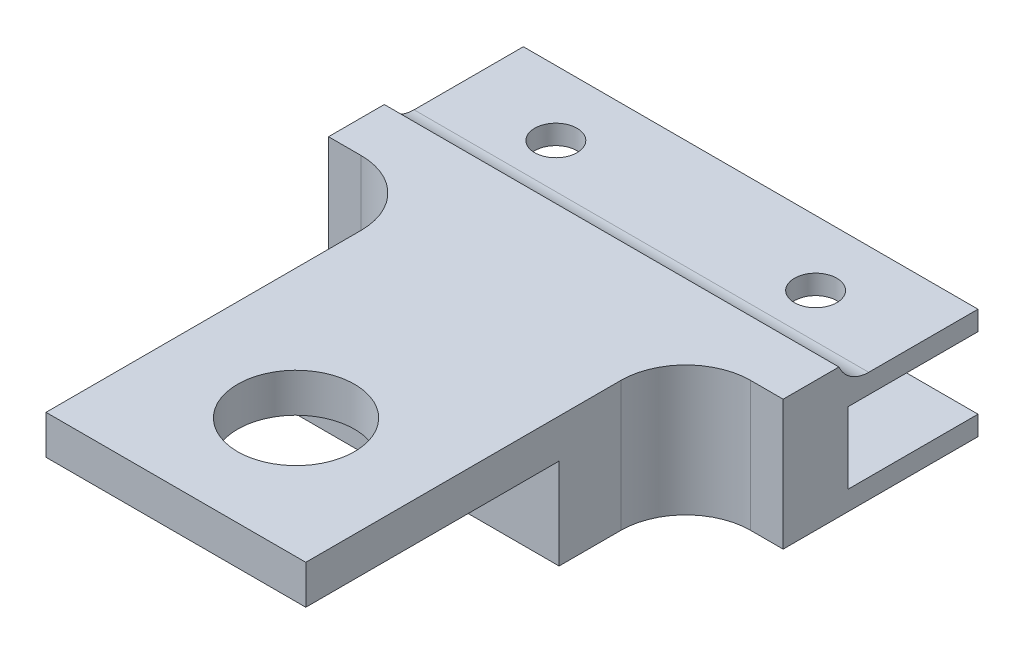
ISO-10303-21;
HEADER;
FILE_DESCRIPTION(('STEP AP214'),'2;1');
FILE_NAME('part.step','',(''),(''),'','','');
FILE_SCHEMA(('AUTOMOTIVE_DESIGN { 1 0 10303 214 1 1 1 1 }'));
ENDSEC;
DATA;
#1=APPLICATION_CONTEXT('core data for automotive mechanical design processes');
#2=APPLICATION_PROTOCOL_DEFINITION('international standard','automotive_design',2000,#1);
#3=PRODUCT_CONTEXT('',#1,'mechanical');
#4=PRODUCT('Part','Part','',(#3));
#5=PRODUCT_RELATED_PRODUCT_CATEGORY('part','',(#4));
#6=PRODUCT_DEFINITION_FORMATION('','',#4);
#7=PRODUCT_DEFINITION_CONTEXT('part definition',#1,'design');
#8=PRODUCT_DEFINITION('design','',#6,#7);
#9=PRODUCT_DEFINITION_SHAPE('','',#8);
#10=(LENGTH_UNIT() NAMED_UNIT(*) SI_UNIT(.MILLI.,.METRE.));
#11=(NAMED_UNIT(*) PLANE_ANGLE_UNIT() SI_UNIT($,.RADIAN.));
#12=(NAMED_UNIT(*) SI_UNIT($,.STERADIAN.) SOLID_ANGLE_UNIT());
#13=UNCERTAINTY_MEASURE_WITH_UNIT(LENGTH_MEASURE(1.E-05),#10,'distance_accuracy_value','');
#14=(GEOMETRIC_REPRESENTATION_CONTEXT(3) GLOBAL_UNCERTAINTY_ASSIGNED_CONTEXT((#13)) GLOBAL_UNIT_ASSIGNED_CONTEXT((#10,
#11,#12)) REPRESENTATION_CONTEXT('',''));
#15=CARTESIAN_POINT('',(0.,0.,0.));
#16=DIRECTION('',(0.,0.,1.));
#17=DIRECTION('',(1.,0.,0.));
#18=AXIS2_PLACEMENT_3D('',#15,#16,#17);
#19=CARTESIAN_POINT('',(0.,0.,19.5));
#20=DIRECTION('',(0.,0.,-1.));
#21=DIRECTION('',(-1.,0.,0.));
#22=AXIS2_PLACEMENT_3D('',#19,#20,#21);
#23=PLANE('',#22);
#24=DIRECTION('',(1.,0.,0.));
#25=VECTOR('',#24,1.);
#26=CARTESIAN_POINT('',(0.,5.5,19.5));
#27=LINE('',#26,#25);
#28=CARTESIAN_POINT('',(-20.,5.5,19.5));
#29=VERTEX_POINT('',#28);
#30=CARTESIAN_POINT('',(20.,5.5,19.5));
#31=VERTEX_POINT('',#30);
#32=EDGE_CURVE('E258',#29,#31,#27,.T.);
#33=ORIENTED_EDGE('',*,*,#32,.F.);
#34=DIRECTION('',(0.,-1.,0.));
#35=VECTOR('',#34,1.);
#36=CARTESIAN_POINT('',(-20.,-5.5,19.5));
#37=LINE('',#36,#35);
#38=CARTESIAN_POINT('',(-20.,-8.5,19.5));
#39=VERTEX_POINT('',#38);
#40=EDGE_CURVE('E395',#29,#39,#37,.T.);
#41=ORIENTED_EDGE('',*,*,#40,.T.);
#42=DIRECTION('',(-1.,0.,0.));
#43=VECTOR('',#42,1.);
#44=CARTESIAN_POINT('',(0.,-8.5,19.5));
#45=LINE('',#44,#43);
#46=CARTESIAN_POINT('',(20.,-8.5,19.5));
#47=VERTEX_POINT('',#46);
#48=EDGE_CURVE('E317',#47,#39,#45,.T.);
#49=ORIENTED_EDGE('',*,*,#48,.F.);
#50=DIRECTION('',(0.,1.,0.));
#51=VECTOR('',#50,1.);
#52=CARTESIAN_POINT('',(20.,-5.5,19.5));
#53=LINE('',#52,#51);
#54=EDGE_CURVE('E388',#47,#31,#53,.T.);
#55=ORIENTED_EDGE('',*,*,#54,.T.);
#56=EDGE_LOOP('',(#33,#41,#49,#55));
#57=FACE_BOUND('',#56,.T.);
#58=ADVANCED_FACE('F65',(#57),#23,.F.);
#59=CARTESIAN_POINT('',(20.,-5.5,19.5));
#60=DIRECTION('',(-1.,0.,0.));
#61=DIRECTION('',(0.,0.,1.));
#62=AXIS2_PLACEMENT_3D('',#59,#60,#61);
#63=PLANE('',#62);
#64=DIRECTION('',(0.,0.,1.));
#65=VECTOR('',#64,1.);
#66=CARTESIAN_POINT('',(20.,-8.5,0.));
#67=LINE('',#66,#65);
#68=CARTESIAN_POINT('',(20.,-8.5,10.));
#69=VERTEX_POINT('',#68);
#70=EDGE_CURVE('E334',#69,#47,#67,.T.);
#71=ORIENTED_EDGE('',*,*,#70,.F.);
#72=DIRECTION('',(0.,1.,0.));
#73=VECTOR('',#72,1.);
#74=CARTESIAN_POINT('',(20.,-5.5,10.));
#75=LINE('',#74,#73);
#76=CARTESIAN_POINT('',(20.,11.5,10.));
#77=VERTEX_POINT('',#76);
#78=EDGE_CURVE('E409',#69,#77,#75,.T.);
#79=ORIENTED_EDGE('',*,*,#78,.T.);
#80=DIRECTION('',(0.,0.,-1.));
#81=VECTOR('',#80,1.);
#82=CARTESIAN_POINT('',(20.,11.5,0.));
#83=LINE('',#82,#81);
#84=CARTESIAN_POINT('',(20.,11.5,58.5));
#85=VERTEX_POINT('',#84);
#86=EDGE_CURVE('E232',#85,#77,#83,.T.);
#87=ORIENTED_EDGE('',*,*,#86,.F.);
#88=DIRECTION('',(0.,1.,0.));
#89=VECTOR('',#88,1.);
#90=CARTESIAN_POINT('',(20.,5.5,58.5));
#91=LINE('',#90,#89);
#92=CARTESIAN_POINT('',(20.,5.5,58.5));
#93=VERTEX_POINT('',#92);
#94=EDGE_CURVE('E255',#93,#85,#91,.T.);
#95=ORIENTED_EDGE('',*,*,#94,.F.);
#96=DIRECTION('',(0.,0.,-1.));
#97=VECTOR('',#96,1.);
#98=CARTESIAN_POINT('',(20.,5.5,0.));
#99=LINE('',#98,#97);
#100=EDGE_CURVE('E246',#93,#31,#99,.T.);
#101=ORIENTED_EDGE('',*,*,#100,.T.);
#102=ORIENTED_EDGE('',*,*,#54,.F.);
#103=EDGE_LOOP('',(#71,#79,#87,#95,#101,#102));
#104=FACE_BOUND('',#103,.T.);
#105=ADVANCED_FACE('F481',(#104),#63,.F.);
#106=CARTESIAN_POINT('',(-20.,-5.5,19.5));
#107=DIRECTION('',(1.,0.,0.));
#108=DIRECTION('',(0.,0.,-1.));
#109=AXIS2_PLACEMENT_3D('',#106,#107,#108);
#110=PLANE('',#109);
#111=DIRECTION('',(0.,0.,1.));
#112=VECTOR('',#111,1.);
#113=CARTESIAN_POINT('',(-20.,11.5,0.));
#114=LINE('',#113,#112);
#115=CARTESIAN_POINT('',(-20.,11.5,10.));
#116=VERTEX_POINT('',#115);
#117=CARTESIAN_POINT('',(-20.,11.5,58.5));
#118=VERTEX_POINT('',#117);
#119=EDGE_CURVE('E225',#116,#118,#114,.T.);
#120=ORIENTED_EDGE('',*,*,#119,.F.);
#121=DIRECTION('',(0.,-1.,0.));
#122=VECTOR('',#121,1.);
#123=CARTESIAN_POINT('',(-20.,-5.5,10.));
#124=LINE('',#123,#122);
#125=CARTESIAN_POINT('',(-20.,-8.5,10.));
#126=VERTEX_POINT('',#125);
#127=EDGE_CURVE('E201',#116,#126,#124,.T.);
#128=ORIENTED_EDGE('',*,*,#127,.T.);
#129=DIRECTION('',(0.,0.,-1.));
#130=VECTOR('',#129,1.);
#131=CARTESIAN_POINT('',(-20.,-8.5,0.));
#132=LINE('',#131,#130);
#133=EDGE_CURVE('E330',#39,#126,#132,.T.);
#134=ORIENTED_EDGE('',*,*,#133,.F.);
#135=ORIENTED_EDGE('',*,*,#40,.F.);
#136=DIRECTION('',(0.,0.,1.));
#137=VECTOR('',#136,1.);
#138=CARTESIAN_POINT('',(-20.,5.5,0.));
#139=LINE('',#138,#137);
#140=CARTESIAN_POINT('',(-20.,5.5,58.5));
#141=VERTEX_POINT('',#140);
#142=EDGE_CURVE('E239',#29,#141,#139,.T.);
#143=ORIENTED_EDGE('',*,*,#142,.T.);
#144=DIRECTION('',(0.,1.,0.));
#145=VECTOR('',#144,1.);
#146=CARTESIAN_POINT('',(-20.,5.5,58.5));
#147=LINE('',#146,#145);
#148=EDGE_CURVE('E254',#141,#118,#147,.T.);
#149=ORIENTED_EDGE('',*,*,#148,.T.);
#150=EDGE_LOOP('',(#120,#128,#134,#135,#143,#149));
#151=FACE_BOUND('',#150,.T.);
#152=ADVANCED_FACE('F489',(#151),#110,.F.);
#153=CARTESIAN_POINT('',(0.,0.,0.));
#154=DIRECTION('',(0.,0.,1.));
#155=DIRECTION('',(1.,0.,0.));
#156=AXIS2_PLACEMENT_3D('',#153,#154,#155);
#157=PLANE('',#156);
#158=DIRECTION('',(1.,0.,0.));
#159=VECTOR('',#158,1.);
#160=CARTESIAN_POINT('',(0.,11.5,0.));
#161=LINE('',#160,#159);
#162=CARTESIAN_POINT('',(30.,11.5,0.));
#163=VERTEX_POINT('',#162);
#164=CARTESIAN_POINT('',(35.,11.5,0.));
#165=VERTEX_POINT('',#164);
#166=EDGE_CURVE('E210',#163,#165,#161,.T.);
#167=ORIENTED_EDGE('',*,*,#166,.F.);
#168=DIRECTION('',(0.,1.,0.));
#169=VECTOR('',#168,1.);
#170=CARTESIAN_POINT('',(30.,0.,0.));
#171=LINE('',#170,#169);
#172=CARTESIAN_POINT('',(30.,-8.5,0.));
#173=VERTEX_POINT('',#172);
#174=EDGE_CURVE('E81',#163,#173,#171,.F.);
#175=ORIENTED_EDGE('',*,*,#174,.T.);
#176=DIRECTION('',(1.,0.,0.));
#177=VECTOR('',#176,1.);
#178=CARTESIAN_POINT('',(-35.,-8.5,0.));
#179=LINE('',#178,#177);
#180=CARTESIAN_POINT('',(35.,-8.5,0.));
#181=VERTEX_POINT('',#180);
#182=EDGE_CURVE('E297',#173,#181,#179,.T.);
#183=ORIENTED_EDGE('',*,*,#182,.T.);
#184=DIRECTION('',(0.,-1.,0.));
#185=VECTOR('',#184,1.);
#186=CARTESIAN_POINT('',(35.,-5.5,0.));
#187=LINE('',#186,#185);
#188=EDGE_CURVE('E376',#165,#181,#187,.T.);
#189=ORIENTED_EDGE('',*,*,#188,.F.);
#190=EDGE_LOOP('',(#167,#175,#183,#189));
#191=FACE_BOUND('',#190,.T.);
#192=ADVANCED_FACE('F423',(#191),#157,.T.);
#193=CARTESIAN_POINT('',(-35.,-8.5,0.));
#194=VERTEX_POINT('',#193);
#195=CARTESIAN_POINT('',(-30.,-8.5,0.));
#196=VERTEX_POINT('',#195);
#197=EDGE_CURVE('E335',#194,#196,#179,.T.);
#198=ORIENTED_EDGE('',*,*,#197,.T.);
#199=DIRECTION('',(0.,-1.,0.));
#200=VECTOR('',#199,1.);
#201=CARTESIAN_POINT('',(-30.,0.,0.));
#202=LINE('',#201,#200);
#203=CARTESIAN_POINT('',(-30.,11.5,0.));
#204=VERTEX_POINT('',#203);
#205=EDGE_CURVE('E406',#196,#204,#202,.F.);
#206=ORIENTED_EDGE('',*,*,#205,.T.);
#207=CARTESIAN_POINT('',(-35.,11.5,0.));
#208=VERTEX_POINT('',#207);
#209=EDGE_CURVE('E219',#208,#204,#161,.T.);
#210=ORIENTED_EDGE('',*,*,#209,.F.);
#211=DIRECTION('',(0.,1.,0.));
#212=VECTOR('',#211,1.);
#213=CARTESIAN_POINT('',(-35.,-5.5,0.));
#214=LINE('',#213,#212);
#215=EDGE_CURVE('E370',#194,#208,#214,.T.);
#216=ORIENTED_EDGE('',*,*,#215,.F.);
#217=EDGE_LOOP('',(#198,#206,#210,#216));
#218=FACE_BOUND('',#217,.T.);
#219=ADVANCED_FACE('F601',(#218),#157,.T.);
#220=CARTESIAN_POINT('',(-35.,-5.5,-10.));
#221=DIRECTION('',(1.,0.,0.));
#222=DIRECTION('',(0.,0.,-1.));
#223=AXIS2_PLACEMENT_3D('',#220,#221,#222);
#224=PLANE('',#223);
#225=DIRECTION('',(0.,0.,1.));
#226=VECTOR('',#225,1.);
#227=CARTESIAN_POINT('',(-35.,11.5,0.));
#228=LINE('',#227,#226);
#229=CARTESIAN_POINT('',(-35.,11.5,-8.58807904200709));
#230=VERTEX_POINT('',#229);
#231=EDGE_CURVE('E216',#230,#208,#228,.T.);
#232=ORIENTED_EDGE('',*,*,#231,.F.);
#233=CARTESIAN_POINT('',(-35.,13.5,-13.1706547369629));
#234=DIRECTION('',(1.,0.,0.));
#235=DIRECTION('',(0.,0.,-1.));
#236=AXIS2_PLACEMENT_3D('',#233,#234,#235);
#237=CIRCLE('',#236,5.);
#238=CARTESIAN_POINT('',(-35.,8.5,-13.1706547369629));
#239=VERTEX_POINT('',#238);
#240=EDGE_CURVE('E202',#230,#239,#237,.T.);
#241=ORIENTED_EDGE('',*,*,#240,.T.);
#242=DIRECTION('',(0.,0.,-1.));
#243=VECTOR('',#242,1.);
#244=CARTESIAN_POINT('',(-35.,8.5,0.));
#245=LINE('',#244,#243);
#246=CARTESIAN_POINT('',(-35.,8.5,-30.));
#247=VERTEX_POINT('',#246);
#248=EDGE_CURVE('E344',#239,#247,#245,.T.);
#249=ORIENTED_EDGE('',*,*,#248,.T.);
#250=DIRECTION('',(0.,-1.,0.));
#251=VECTOR('',#250,1.);
#252=CARTESIAN_POINT('',(-35.,8.5,-30.));
#253=LINE('',#252,#251);
#254=CARTESIAN_POINT('',(-35.,5.5,-30.));
#255=VERTEX_POINT('',#254);
#256=EDGE_CURVE('E354',#247,#255,#253,.T.);
#257=ORIENTED_EDGE('',*,*,#256,.T.);
#258=DIRECTION('',(0.,0.,-1.));
#259=VECTOR('',#258,1.);
#260=CARTESIAN_POINT('',(-35.,5.5,0.));
#261=LINE('',#260,#259);
#262=CARTESIAN_POINT('',(-35.,5.5,-10.));
#263=VERTEX_POINT('',#262);
#264=EDGE_CURVE('E329',#263,#255,#261,.T.);
#265=ORIENTED_EDGE('',*,*,#264,.F.);
#266=DIRECTION('',(0.,1.,0.));
#267=VECTOR('',#266,1.);
#268=CARTESIAN_POINT('',(-35.,-5.5,-10.));
#269=LINE('',#268,#267);
#270=CARTESIAN_POINT('',(-35.,-5.5,-10.));
#271=VERTEX_POINT('',#270);
#272=EDGE_CURVE('E371',#271,#263,#269,.T.);
#273=ORIENTED_EDGE('',*,*,#272,.F.);
#274=DIRECTION('',(0.,0.,1.));
#275=VECTOR('',#274,1.);
#276=CARTESIAN_POINT('',(-35.,-5.5,0.));
#277=LINE('',#276,#275);
#278=CARTESIAN_POINT('',(-35.,-5.5,-30.));
#279=VERTEX_POINT('',#278);
#280=EDGE_CURVE('E303',#279,#271,#277,.T.);
#281=ORIENTED_EDGE('',*,*,#280,.F.);
#282=DIRECTION('',(0.,1.,0.));
#283=VECTOR('',#282,1.);
#284=CARTESIAN_POINT('',(-35.,-8.5,-30.));
#285=LINE('',#284,#283);
#286=CARTESIAN_POINT('',(-35.,-8.5,-30.));
#287=VERTEX_POINT('',#286);
#288=EDGE_CURVE('E311',#287,#279,#285,.T.);
#289=ORIENTED_EDGE('',*,*,#288,.F.);
#290=DIRECTION('',(0.,0.,1.));
#291=VECTOR('',#290,1.);
#292=CARTESIAN_POINT('',(-35.,-8.5,0.));
#293=LINE('',#292,#291);
#294=EDGE_CURVE('E307',#287,#194,#293,.T.);
#295=ORIENTED_EDGE('',*,*,#294,.T.);
#296=ORIENTED_EDGE('',*,*,#215,.T.);
#297=EDGE_LOOP('',(#232,#241,#249,#257,#265,#273,#281,#289,#295,#296));
#298=FACE_BOUND('',#297,.T.);
#299=ADVANCED_FACE('F443',(#298),#224,.F.);
#300=CARTESIAN_POINT('',(35.,-5.5,-10.));
#301=DIRECTION('',(-1.,0.,0.));
#302=DIRECTION('',(0.,0.,1.));
#303=AXIS2_PLACEMENT_3D('',#300,#301,#302);
#304=PLANE('',#303);
#305=DIRECTION('',(0.,0.,-1.));
#306=VECTOR('',#305,1.);
#307=CARTESIAN_POINT('',(35.,8.5,0.));
#308=LINE('',#307,#306);
#309=CARTESIAN_POINT('',(35.,8.5,-13.1706547369629));
#310=VERTEX_POINT('',#309);
#311=CARTESIAN_POINT('',(35.,8.5,-30.));
#312=VERTEX_POINT('',#311);
#313=EDGE_CURVE('E196',#310,#312,#308,.T.);
#314=ORIENTED_EDGE('',*,*,#313,.F.);
#315=CARTESIAN_POINT('',(35.,13.5,-13.1706547369629));
#316=DIRECTION('',(-1.,0.,0.));
#317=DIRECTION('',(0.,0.,1.));
#318=AXIS2_PLACEMENT_3D('',#315,#316,#317);
#319=CIRCLE('',#318,5.);
#320=CARTESIAN_POINT('',(35.,11.5,-8.58807904200709));
#321=VERTEX_POINT('',#320);
#322=EDGE_CURVE('E190',#310,#321,#319,.T.);
#323=ORIENTED_EDGE('',*,*,#322,.T.);
#324=DIRECTION('',(0.,0.,-1.));
#325=VECTOR('',#324,1.);
#326=CARTESIAN_POINT('',(35.,11.5,0.));
#327=LINE('',#326,#325);
#328=EDGE_CURVE('E194',#165,#321,#327,.T.);
#329=ORIENTED_EDGE('',*,*,#328,.F.);
#330=ORIENTED_EDGE('',*,*,#188,.T.);
#331=DIRECTION('',(0.,0.,1.));
#332=VECTOR('',#331,1.);
#333=CARTESIAN_POINT('',(35.,-8.5,0.));
#334=LINE('',#333,#332);
#335=CARTESIAN_POINT('',(35.,-8.5,-30.));
#336=VERTEX_POINT('',#335);
#337=EDGE_CURVE('E302',#336,#181,#334,.T.);
#338=ORIENTED_EDGE('',*,*,#337,.F.);
#339=DIRECTION('',(0.,1.,0.));
#340=VECTOR('',#339,1.);
#341=CARTESIAN_POINT('',(35.,-8.5,-30.));
#342=LINE('',#341,#340);
#343=CARTESIAN_POINT('',(35.,-5.5,-30.));
#344=VERTEX_POINT('',#343);
#345=EDGE_CURVE('E325',#336,#344,#342,.T.);
#346=ORIENTED_EDGE('',*,*,#345,.T.);
#347=DIRECTION('',(0.,0.,1.));
#348=VECTOR('',#347,1.);
#349=CARTESIAN_POINT('',(35.,-5.5,0.));
#350=LINE('',#349,#348);
#351=CARTESIAN_POINT('',(35.,-5.5,-10.));
#352=VERTEX_POINT('',#351);
#353=EDGE_CURVE('E316',#344,#352,#350,.T.);
#354=ORIENTED_EDGE('',*,*,#353,.T.);
#355=DIRECTION('',(0.,-1.,0.));
#356=VECTOR('',#355,1.);
#357=CARTESIAN_POINT('',(35.,-5.5,-10.));
#358=LINE('',#357,#356);
#359=CARTESIAN_POINT('',(35.,5.5,-10.));
#360=VERTEX_POINT('',#359);
#361=EDGE_CURVE('E380',#360,#352,#358,.T.);
#362=ORIENTED_EDGE('',*,*,#361,.F.);
#363=DIRECTION('',(0.,0.,-1.));
#364=VECTOR('',#363,1.);
#365=CARTESIAN_POINT('',(35.,5.5,0.));
#366=LINE('',#365,#364);
#367=CARTESIAN_POINT('',(35.,5.5,-30.));
#368=VERTEX_POINT('',#367);
#369=EDGE_CURVE('E357',#360,#368,#366,.T.);
#370=ORIENTED_EDGE('',*,*,#369,.T.);
#371=DIRECTION('',(0.,-1.,0.));
#372=VECTOR('',#371,1.);
#373=CARTESIAN_POINT('',(35.,8.5,-30.));
#374=LINE('',#373,#372);
#375=EDGE_CURVE('E366',#312,#368,#374,.T.);
#376=ORIENTED_EDGE('',*,*,#375,.F.);
#377=EDGE_LOOP('',(#314,#323,#329,#330,#338,#346,#354,#362,#370,#376));
#378=FACE_BOUND('',#377,.T.);
#379=ADVANCED_FACE('F192',(#378),#304,.F.);
#380=CARTESIAN_POINT('',(0.,0.,-10.));
#381=DIRECTION('',(0.,0.,1.));
#382=DIRECTION('',(1.,0.,0.));
#383=AXIS2_PLACEMENT_3D('',#380,#381,#382);
#384=PLANE('',#383);
#385=ORIENTED_EDGE('',*,*,#272,.T.);
#386=DIRECTION('',(1.,0.,0.));
#387=VECTOR('',#386,1.);
#388=CARTESIAN_POINT('',(35.,5.5,-10.));
#389=LINE('',#388,#387);
#390=EDGE_CURVE('E375',#263,#360,#389,.T.);
#391=ORIENTED_EDGE('',*,*,#390,.T.);
#392=ORIENTED_EDGE('',*,*,#361,.T.);
#393=DIRECTION('',(-1.,0.,0.));
#394=VECTOR('',#393,1.);
#395=CARTESIAN_POINT('',(35.,-5.5,-10.));
#396=LINE('',#395,#394);
#397=EDGE_CURVE('E384',#352,#271,#396,.T.);
#398=ORIENTED_EDGE('',*,*,#397,.T.);
#399=EDGE_LOOP('',(#385,#391,#392,#398));
#400=FACE_BOUND('',#399,.T.);
#401=ADVANCED_FACE('F437',(#400),#384,.F.);
#402=CARTESIAN_POINT('',(0.,8.5,-30.));
#403=DIRECTION('',(0.,0.,-1.));
#404=DIRECTION('',(-1.,0.,0.));
#405=AXIS2_PLACEMENT_3D('',#402,#403,#404);
#406=PLANE('',#405);
#407=DIRECTION('',(1.,0.,0.));
#408=VECTOR('',#407,1.);
#409=CARTESIAN_POINT('',(0.,5.5,-30.));
#410=LINE('',#409,#408);
#411=EDGE_CURVE('E347',#255,#368,#410,.T.);
#412=ORIENTED_EDGE('',*,*,#411,.F.);
#413=ORIENTED_EDGE('',*,*,#256,.F.);
#414=DIRECTION('',(1.,0.,0.));
#415=VECTOR('',#414,1.);
#416=CARTESIAN_POINT('',(0.,8.5,-30.));
#417=LINE('',#416,#415);
#418=EDGE_CURVE('E350',#247,#312,#417,.T.);
#419=ORIENTED_EDGE('',*,*,#418,.T.);
#420=ORIENTED_EDGE('',*,*,#375,.T.);
#421=EDGE_LOOP('',(#412,#413,#419,#420));
#422=FACE_BOUND('',#421,.T.);
#423=ADVANCED_FACE('F450',(#422),#406,.T.);
#424=CARTESIAN_POINT('',(0.,8.5,0.));
#425=DIRECTION('',(0.,1.,0.));
#426=DIRECTION('',(0.,0.,1.));
#427=AXIS2_PLACEMENT_3D('',#424,#425,#426);
#428=PLANE('',#427);
#429=ORIENTED_EDGE('',*,*,#248,.F.);
#430=DIRECTION('',(-1.,0.,0.));
#431=VECTOR('',#430,1.);
#432=CARTESIAN_POINT('',(35.,8.5,-13.1706547369629));
#433=LINE('',#432,#431);
#434=EDGE_CURVE('E398',#239,#310,#433,.F.);
#435=ORIENTED_EDGE('',*,*,#434,.T.);
#436=ORIENTED_EDGE('',*,*,#313,.T.);
#437=ORIENTED_EDGE('',*,*,#418,.F.);
#438=EDGE_LOOP('',(#429,#435,#436,#437));
#439=FACE_BOUND('',#438,.T.);
#440=CARTESIAN_POINT('',(-20.,8.5,-20.));
#441=DIRECTION('',(0.,-1.,0.));
#442=DIRECTION('',(0.,0.,-1.));
#443=AXIS2_PLACEMENT_3D('',#440,#441,#442);
#444=CIRCLE('',#443,3.26452314900339);
#445=CARTESIAN_POINT('',(-20.,8.5,-23.2645231490034));
#446=VERTEX_POINT('',#445);
#447=EDGE_CURVE('E266',#446,#446,#444,.T.);
#448=ORIENTED_EDGE('',*,*,#447,.T.);
#449=EDGE_LOOP('',(#448));
#450=FACE_BOUND('',#449,.T.);
#451=CARTESIAN_POINT('',(20.,8.5,-20.));
#452=DIRECTION('',(0.,-1.,0.));
#453=DIRECTION('',(0.,0.,1.));
#454=AXIS2_PLACEMENT_3D('',#451,#452,#453);
#455=CIRCLE('',#454,3.26452314900339);
#456=CARTESIAN_POINT('',(20.,8.5,-16.7354768509966));
#457=VERTEX_POINT('',#456);
#458=EDGE_CURVE('E275',#457,#457,#455,.T.);
#459=ORIENTED_EDGE('',*,*,#458,.T.);
#460=EDGE_LOOP('',(#459));
#461=FACE_BOUND('',#460,.T.);
#462=ADVANCED_FACE('F452',(#439,#450,#461),#428,.T.);
#463=CARTESIAN_POINT('',(0.,5.5,0.));
#464=DIRECTION('',(0.,1.,0.));
#465=DIRECTION('',(0.,0.,1.));
#466=AXIS2_PLACEMENT_3D('',#463,#464,#465);
#467=PLANE('',#466);
#468=CARTESIAN_POINT('',(-20.,5.5,-20.));
#469=DIRECTION('',(0.,1.,0.));
#470=DIRECTION('',(0.,0.,1.));
#471=AXIS2_PLACEMENT_3D('',#468,#469,#470);
#472=CIRCLE('',#471,3.26452314900339);
#473=CARTESIAN_POINT('',(-20.,5.5,-16.7354768509966));
#474=VERTEX_POINT('',#473);
#475=EDGE_CURVE('E293',#474,#474,#472,.T.);
#476=ORIENTED_EDGE('',*,*,#475,.T.);
#477=EDGE_LOOP('',(#476));
#478=FACE_BOUND('',#477,.T.);
#479=CARTESIAN_POINT('',(20.,5.5,-20.));
#480=DIRECTION('',(0.,1.,0.));
#481=DIRECTION('',(0.,0.,1.));
#482=AXIS2_PLACEMENT_3D('',#479,#480,#481);
#483=CIRCLE('',#482,3.26452314900339);
#484=CARTESIAN_POINT('',(20.,5.5,-16.7354768509966));
#485=VERTEX_POINT('',#484);
#486=EDGE_CURVE('E285',#485,#485,#483,.T.);
#487=ORIENTED_EDGE('',*,*,#486,.T.);
#488=EDGE_LOOP('',(#487));
#489=FACE_BOUND('',#488,.T.);
#490=ORIENTED_EDGE('',*,*,#390,.F.);
#491=ORIENTED_EDGE('',*,*,#264,.T.);
#492=ORIENTED_EDGE('',*,*,#411,.T.);
#493=ORIENTED_EDGE('',*,*,#369,.F.);
#494=EDGE_LOOP('',(#490,#491,#492,#493));
#495=FACE_BOUND('',#494,.T.);
#496=ADVANCED_FACE('F441',(#478,#489,#495),#467,.F.);
#497=CARTESIAN_POINT('',(0.,-5.5,0.));
#498=DIRECTION('',(0.,-1.,0.));
#499=DIRECTION('',(0.,0.,-1.));
#500=AXIS2_PLACEMENT_3D('',#497,#498,#499);
#501=PLANE('',#500);
#502=CARTESIAN_POINT('',(-20.,-5.5,-20.));
#503=DIRECTION('',(0.,-1.,0.));
#504=DIRECTION('',(0.,0.,-1.));
#505=AXIS2_PLACEMENT_3D('',#502,#503,#504);
#506=CIRCLE('',#505,3.26452314900339);
#507=CARTESIAN_POINT('',(-20.,-5.5,-23.2645231490034));
#508=VERTEX_POINT('',#507);
#509=EDGE_CURVE('E289',#508,#508,#506,.T.);
#510=ORIENTED_EDGE('',*,*,#509,.T.);
#511=EDGE_LOOP('',(#510));
#512=FACE_BOUND('',#511,.T.);
#513=CARTESIAN_POINT('',(20.,-5.5,-20.));
#514=DIRECTION('',(0.,-1.,0.));
#515=DIRECTION('',(0.,0.,-1.));
#516=AXIS2_PLACEMENT_3D('',#513,#514,#515);
#517=CIRCLE('',#516,3.26452314900339);
#518=CARTESIAN_POINT('',(20.,-5.5,-23.2645231490034));
#519=VERTEX_POINT('',#518);
#520=EDGE_CURVE('E270',#519,#519,#517,.T.);
#521=ORIENTED_EDGE('',*,*,#520,.T.);
#522=EDGE_LOOP('',(#521));
#523=FACE_BOUND('',#522,.T.);
#524=ORIENTED_EDGE('',*,*,#397,.F.);
#525=ORIENTED_EDGE('',*,*,#353,.F.);
#526=DIRECTION('',(1.,0.,0.));
#527=VECTOR('',#526,1.);
#528=CARTESIAN_POINT('',(0.,-5.5,-30.));
#529=LINE('',#528,#527);
#530=EDGE_CURVE('E312',#279,#344,#529,.T.);
#531=ORIENTED_EDGE('',*,*,#530,.F.);
#532=ORIENTED_EDGE('',*,*,#280,.T.);
#533=EDGE_LOOP('',(#524,#525,#531,#532));
#534=FACE_BOUND('',#533,.T.);
#535=ADVANCED_FACE('F470',(#512,#523,#534),#501,.F.);
#536=CARTESIAN_POINT('',(0.,-8.5,-30.));
#537=DIRECTION('',(0.,0.,1.));
#538=DIRECTION('',(1.,0.,0.));
#539=AXIS2_PLACEMENT_3D('',#536,#537,#538);
#540=PLANE('',#539);
#541=ORIENTED_EDGE('',*,*,#530,.T.);
#542=ORIENTED_EDGE('',*,*,#345,.F.);
#543=DIRECTION('',(1.,0.,0.));
#544=VECTOR('',#543,1.);
#545=CARTESIAN_POINT('',(0.,-8.5,-30.));
#546=LINE('',#545,#544);
#547=EDGE_CURVE('E298',#287,#336,#546,.T.);
#548=ORIENTED_EDGE('',*,*,#547,.F.);
#549=ORIENTED_EDGE('',*,*,#288,.T.);
#550=EDGE_LOOP('',(#541,#542,#548,#549));
#551=FACE_BOUND('',#550,.T.);
#552=ADVANCED_FACE('F432',(#551),#540,.F.);
#553=CARTESIAN_POINT('',(0.,-8.5,0.));
#554=DIRECTION('',(0.,-1.,0.));
#555=DIRECTION('',(0.,0.,-1.));
#556=AXIS2_PLACEMENT_3D('',#553,#554,#555);
#557=PLANE('',#556);
#558=CARTESIAN_POINT('',(-20.,-8.5,-20.));
#559=DIRECTION('',(0.,-1.,0.));
#560=DIRECTION('',(0.,0.,-1.));
#561=AXIS2_PLACEMENT_3D('',#558,#559,#560);
#562=CIRCLE('',#561,3.26452314900339);
#563=CARTESIAN_POINT('',(-20.,-8.5,-23.2645231490034));
#564=VERTEX_POINT('',#563);
#565=EDGE_CURVE('E271',#564,#564,#562,.T.);
#566=ORIENTED_EDGE('',*,*,#565,.F.);
#567=EDGE_LOOP('',(#566));
#568=FACE_BOUND('',#567,.T.);
#569=CARTESIAN_POINT('',(20.,-8.5,-20.));
#570=DIRECTION('',(0.,-1.,0.));
#571=DIRECTION('',(0.,0.,1.));
#572=AXIS2_PLACEMENT_3D('',#569,#570,#571);
#573=CIRCLE('',#572,3.26452314900339);
#574=CARTESIAN_POINT('',(20.,-8.5,-16.7354768509966));
#575=VERTEX_POINT('',#574);
#576=EDGE_CURVE('E265',#575,#575,#573,.T.);
#577=ORIENTED_EDGE('',*,*,#576,.F.);
#578=EDGE_LOOP('',(#577));
#579=FACE_BOUND('',#578,.T.);
#580=ORIENTED_EDGE('',*,*,#547,.T.);
#581=ORIENTED_EDGE('',*,*,#337,.T.);
#582=ORIENTED_EDGE('',*,*,#182,.F.);
#583=CARTESIAN_POINT('',(30.,-8.5,10.));
#584=DIRECTION('',(0.,-1.,0.));
#585=DIRECTION('',(0.,0.,-1.));
#586=AXIS2_PLACEMENT_3D('',#583,#584,#585);
#587=CIRCLE('',#586,10.);
#588=EDGE_CURVE('E12',#173,#69,#587,.F.);
#589=ORIENTED_EDGE('',*,*,#588,.T.);
#590=ORIENTED_EDGE('',*,*,#70,.T.);
#591=ORIENTED_EDGE('',*,*,#48,.T.);
#592=ORIENTED_EDGE('',*,*,#133,.T.);
#593=CARTESIAN_POINT('',(-30.,-8.5,10.));
#594=DIRECTION('',(0.,-1.,0.));
#595=DIRECTION('',(0.,0.,-1.));
#596=AXIS2_PLACEMENT_3D('',#593,#594,#595);
#597=CIRCLE('',#596,10.);
#598=EDGE_CURVE('E415',#126,#196,#597,.F.);
#599=ORIENTED_EDGE('',*,*,#598,.T.);
#600=ORIENTED_EDGE('',*,*,#197,.F.);
#601=ORIENTED_EDGE('',*,*,#294,.F.);
#602=EDGE_LOOP('',(#580,#581,#582,#589,#590,#591,#592,#599,#600,#601));
#603=FACE_BOUND('',#602,.T.);
#604=ADVANCED_FACE('F426',(#568,#579,#603),#557,.T.);
#605=CARTESIAN_POINT('',(20.,8.5,-20.));
#606=DIRECTION('',(0.,-1.,0.));
#607=DIRECTION('',(0.,0.,-1.));
#608=AXIS2_PLACEMENT_3D('',#605,#606,#607);
#609=CYLINDRICAL_SURFACE('',#608,3.26452314900339);
#610=ORIENTED_EDGE('',*,*,#576,.T.);
#611=EDGE_LOOP('',(#610));
#612=FACE_BOUND('',#611,.T.);
#613=ORIENTED_EDGE('',*,*,#520,.F.);
#614=EDGE_LOOP('',(#613));
#615=FACE_BOUND('',#614,.T.);
#616=ADVANCED_FACE('F466',(#612,#615),#609,.F.);
#617=CARTESIAN_POINT('',(-20.,8.5,-20.));
#618=DIRECTION('',(0.,-1.,0.));
#619=DIRECTION('',(0.,0.,-1.));
#620=AXIS2_PLACEMENT_3D('',#617,#618,#619);
#621=CYLINDRICAL_SURFACE('',#620,3.26452314900339);
#622=ORIENTED_EDGE('',*,*,#565,.T.);
#623=EDGE_LOOP('',(#622));
#624=FACE_BOUND('',#623,.T.);
#625=ORIENTED_EDGE('',*,*,#509,.F.);
#626=EDGE_LOOP('',(#625));
#627=FACE_BOUND('',#626,.T.);
#628=ADVANCED_FACE('F464',(#624,#627),#621,.F.);
#629=ORIENTED_EDGE('',*,*,#458,.F.);
#630=EDGE_LOOP('',(#629));
#631=FACE_BOUND('',#630,.T.);
#632=ORIENTED_EDGE('',*,*,#486,.F.);
#633=EDGE_LOOP('',(#632));
#634=FACE_BOUND('',#633,.T.);
#635=ADVANCED_FACE('F460',(#631,#634),#609,.F.);
#636=ORIENTED_EDGE('',*,*,#447,.F.);
#637=EDGE_LOOP('',(#636));
#638=FACE_BOUND('',#637,.T.);
#639=ORIENTED_EDGE('',*,*,#475,.F.);
#640=EDGE_LOOP('',(#639));
#641=FACE_BOUND('',#640,.T.);
#642=ADVANCED_FACE('F463',(#638,#641),#621,.F.);
#643=CARTESIAN_POINT('',(0.,5.5,0.));
#644=DIRECTION('',(0.,1.,0.));
#645=DIRECTION('',(0.,0.,1.));
#646=AXIS2_PLACEMENT_3D('',#643,#644,#645);
#647=PLANE('',#646);
#648=CARTESIAN_POINT('',(0.,5.5,40.));
#649=DIRECTION('',(0.,1.,0.));
#650=DIRECTION('',(0.,0.,1.));
#651=AXIS2_PLACEMENT_3D('',#648,#649,#650);
#652=CIRCLE('',#651,9.);
#653=CARTESIAN_POINT('',(0.,5.5,49.));
#654=VERTEX_POINT('',#653);
#655=EDGE_CURVE('E250',#654,#654,#652,.T.);
#656=ORIENTED_EDGE('',*,*,#655,.T.);
#657=EDGE_LOOP('',(#656));
#658=FACE_BOUND('',#657,.T.);
#659=ORIENTED_EDGE('',*,*,#142,.F.);
#660=ORIENTED_EDGE('',*,*,#32,.T.);
#661=ORIENTED_EDGE('',*,*,#100,.F.);
#662=DIRECTION('',(-1.,0.,0.));
#663=VECTOR('',#662,1.);
#664=CARTESIAN_POINT('',(0.,5.5,58.5));
#665=LINE('',#664,#663);
#666=EDGE_CURVE('E242',#93,#141,#665,.T.);
#667=ORIENTED_EDGE('',*,*,#666,.T.);
#668=EDGE_LOOP('',(#659,#660,#661,#667));
#669=FACE_BOUND('',#668,.T.);
#670=ADVANCED_FACE('F526',(#658,#669),#647,.F.);
#671=CARTESIAN_POINT('',(0.,5.5,58.5));
#672=DIRECTION('',(0.,0.,-1.));
#673=DIRECTION('',(-1.,0.,0.));
#674=AXIS2_PLACEMENT_3D('',#671,#672,#673);
#675=PLANE('',#674);
#676=ORIENTED_EDGE('',*,*,#94,.T.);
#677=DIRECTION('',(-1.,0.,0.));
#678=VECTOR('',#677,1.);
#679=CARTESIAN_POINT('',(0.,11.5,58.5));
#680=LINE('',#679,#678);
#681=EDGE_CURVE('E228',#85,#118,#680,.T.);
#682=ORIENTED_EDGE('',*,*,#681,.T.);
#683=ORIENTED_EDGE('',*,*,#148,.F.);
#684=ORIENTED_EDGE('',*,*,#666,.F.);
#685=EDGE_LOOP('',(#676,#682,#683,#684));
#686=FACE_BOUND('',#685,.T.);
#687=ADVANCED_FACE('F518',(#686),#675,.F.);
#688=CARTESIAN_POINT('',(0.,5.5,40.));
#689=DIRECTION('',(0.,1.,0.));
#690=DIRECTION('',(0.,0.,1.));
#691=AXIS2_PLACEMENT_3D('',#688,#689,#690);
#692=CYLINDRICAL_SURFACE('',#691,9.);
#693=ORIENTED_EDGE('',*,*,#655,.F.);
#694=EDGE_LOOP('',(#693));
#695=FACE_BOUND('',#694,.T.);
#696=CARTESIAN_POINT('',(0.,11.5,40.));
#697=DIRECTION('',(0.,1.,0.));
#698=DIRECTION('',(0.,0.,1.));
#699=AXIS2_PLACEMENT_3D('',#696,#697,#698);
#700=CIRCLE('',#699,9.);
#701=CARTESIAN_POINT('',(0.,11.5,49.));
#702=VERTEX_POINT('',#701);
#703=EDGE_CURVE('E235',#702,#702,#700,.T.);
#704=ORIENTED_EDGE('',*,*,#703,.T.);
#705=EDGE_LOOP('',(#704));
#706=FACE_BOUND('',#705,.T.);
#707=ADVANCED_FACE('F533',(#695,#706),#692,.F.);
#708=CARTESIAN_POINT('',(0.,11.5,0.));
#709=DIRECTION('',(0.,1.,0.));
#710=DIRECTION('',(0.,0.,1.));
#711=AXIS2_PLACEMENT_3D('',#708,#709,#710);
#712=PLANE('',#711);
#713=ORIENTED_EDGE('',*,*,#328,.T.);
#714=DIRECTION('',(-1.,0.,0.));
#715=VECTOR('',#714,1.);
#716=CARTESIAN_POINT('',(0.,11.5,-8.58807904200709));
#717=LINE('',#716,#715);
#718=EDGE_CURVE('E208',#321,#230,#717,.T.);
#719=ORIENTED_EDGE('',*,*,#718,.T.);
#720=ORIENTED_EDGE('',*,*,#231,.T.);
#721=ORIENTED_EDGE('',*,*,#209,.T.);
#722=CARTESIAN_POINT('',(-30.,11.5,10.));
#723=DIRECTION('',(0.,1.,0.));
#724=DIRECTION('',(0.,0.,1.));
#725=AXIS2_PLACEMENT_3D('',#722,#723,#724);
#726=CIRCLE('',#725,10.);
#727=EDGE_CURVE('E418',#204,#116,#726,.F.);
#728=ORIENTED_EDGE('',*,*,#727,.T.);
#729=ORIENTED_EDGE('',*,*,#119,.T.);
#730=ORIENTED_EDGE('',*,*,#681,.F.);
#731=ORIENTED_EDGE('',*,*,#86,.T.);
#732=CARTESIAN_POINT('',(30.,11.5,10.));
#733=DIRECTION('',(0.,1.,0.));
#734=DIRECTION('',(0.,0.,1.));
#735=AXIS2_PLACEMENT_3D('',#732,#733,#734);
#736=CIRCLE('',#735,10.);
#737=EDGE_CURVE('E74',#77,#163,#736,.F.);
#738=ORIENTED_EDGE('',*,*,#737,.T.);
#739=ORIENTED_EDGE('',*,*,#166,.T.);
#740=EDGE_LOOP('',(#713,#719,#720,#721,#728,#729,#730,#731,#738,#739));
#741=FACE_BOUND('',#740,.T.);
#742=ORIENTED_EDGE('',*,*,#703,.F.);
#743=EDGE_LOOP('',(#742));
#744=FACE_BOUND('',#743,.T.);
#745=ADVANCED_FACE('F205',(#741,#744),#712,.T.);
#746=CARTESIAN_POINT('',(0.,13.5,-13.1706547369629));
#747=DIRECTION('',(1.,0.,0.));
#748=DIRECTION('',(0.,0.,-1.));
#749=AXIS2_PLACEMENT_3D('',#746,#747,#748);
#750=CYLINDRICAL_SURFACE('',#749,5.);
#751=ORIENTED_EDGE('',*,*,#322,.F.);
#752=ORIENTED_EDGE('',*,*,#434,.F.);
#753=ORIENTED_EDGE('',*,*,#240,.F.);
#754=ORIENTED_EDGE('',*,*,#718,.F.);
#755=EDGE_LOOP('',(#751,#752,#753,#754));
#756=FACE_BOUND('',#755,.T.);
#757=ADVANCED_FACE('F214',(#756),#750,.F.);
#758=CARTESIAN_POINT('',(-30.,-5.5,10.));
#759=DIRECTION('',(0.,-1.,0.));
#760=DIRECTION('',(0.,0.,-1.));
#761=AXIS2_PLACEMENT_3D('',#758,#759,#760);
#762=CYLINDRICAL_SURFACE('',#761,10.);
#763=ORIENTED_EDGE('',*,*,#727,.F.);
#764=ORIENTED_EDGE('',*,*,#205,.F.);
#765=ORIENTED_EDGE('',*,*,#598,.F.);
#766=ORIENTED_EDGE('',*,*,#127,.F.);
#767=EDGE_LOOP('',(#763,#764,#765,#766));
#768=FACE_BOUND('',#767,.T.);
#769=ADVANCED_FACE('F499',(#768),#762,.F.);
#770=CARTESIAN_POINT('',(30.,-5.5,10.));
#771=DIRECTION('',(0.,1.,0.));
#772=DIRECTION('',(0.,0.,1.));
#773=AXIS2_PLACEMENT_3D('',#770,#771,#772);
#774=CYLINDRICAL_SURFACE('',#773,10.);
#775=ORIENTED_EDGE('',*,*,#588,.F.);
#776=ORIENTED_EDGE('',*,*,#174,.F.);
#777=ORIENTED_EDGE('',*,*,#737,.F.);
#778=ORIENTED_EDGE('',*,*,#78,.F.);
#779=EDGE_LOOP('',(#775,#776,#777,#778));
#780=FACE_BOUND('',#779,.T.);
#781=ADVANCED_FACE('F67',(#780),#774,.F.);
#782=CLOSED_SHELL('',(#58,#105,#152,#192,#219,#299,#379,#401,#423,#462,#496,#535,#552,#604,#616,
#628,#635,#642,#670,#687,#707,#745,#757,#769,#781));
#783=MANIFOLD_SOLID_BREP('B2',#782);
#784=ADVANCED_BREP_SHAPE_REPRESENTATION('',(#18,#783),#14);
#785=SHAPE_DEFINITION_REPRESENTATION(#9,#784);
ENDSEC;
END-ISO-10303-21;
